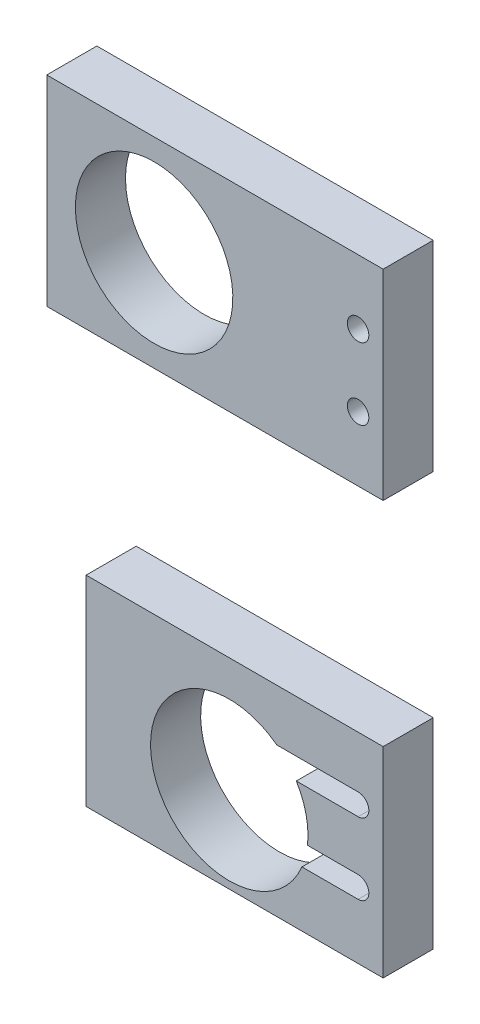
ISO-10303-21;
HEADER;
FILE_DESCRIPTION(('STEP AP214'),'2;1');
FILE_NAME('part.step','',(''),(''),'','','');
FILE_SCHEMA(('AUTOMOTIVE_DESIGN { 1 0 10303 214 1 1 1 1 }'));
ENDSEC;
DATA;
#1=APPLICATION_CONTEXT('core data for automotive mechanical design processes');
#2=APPLICATION_PROTOCOL_DEFINITION('international standard','automotive_design',2000,#1);
#3=PRODUCT_CONTEXT('',#1,'mechanical');
#4=PRODUCT('Part','Part','',(#3));
#5=PRODUCT_RELATED_PRODUCT_CATEGORY('part','',(#4));
#6=PRODUCT_DEFINITION_FORMATION('','',#4);
#7=PRODUCT_DEFINITION_CONTEXT('part definition',#1,'design');
#8=PRODUCT_DEFINITION('design','',#6,#7);
#9=PRODUCT_DEFINITION_SHAPE('','',#8);
#10=(LENGTH_UNIT() NAMED_UNIT(*) SI_UNIT(.MILLI.,.METRE.));
#11=(NAMED_UNIT(*) PLANE_ANGLE_UNIT() SI_UNIT($,.RADIAN.));
#12=(NAMED_UNIT(*) SI_UNIT($,.STERADIAN.) SOLID_ANGLE_UNIT());
#13=UNCERTAINTY_MEASURE_WITH_UNIT(LENGTH_MEASURE(1.E-05),#10,'distance_accuracy_value','');
#14=(GEOMETRIC_REPRESENTATION_CONTEXT(3) GLOBAL_UNCERTAINTY_ASSIGNED_CONTEXT((#13)) GLOBAL_UNIT_ASSIGNED_CONTEXT((#10,
#11,#12)) REPRESENTATION_CONTEXT('',''));
#15=CARTESIAN_POINT('',(0.,0.,0.));
#16=DIRECTION('',(0.,0.,1.));
#17=DIRECTION('',(1.,0.,0.));
#18=AXIS2_PLACEMENT_3D('',#15,#16,#17);
#19=CARTESIAN_POINT('',(0.,0.,-27.08));
#20=DIRECTION('',(0.,0.,-1.));
#21=DIRECTION('',(0.,1.,0.));
#22=AXIS2_PLACEMENT_3D('',#19,#20,#21);
#23=PLANE('',#22);
#24=CARTESIAN_POINT('',(0.,5.,-27.08));
#25=DIRECTION('',(0.,0.,-1.));
#26=DIRECTION('',(0.,1.,0.));
#27=AXIS2_PLACEMENT_3D('',#24,#25,#26);
#28=CIRCLE('',#27,1.5);
#29=CARTESIAN_POINT('',(0.,6.5,-27.08));
#30=VERTEX_POINT('',#29);
#31=EDGE_CURVE('E135',#30,#30,#28,.F.);
#32=ORIENTED_EDGE('',*,*,#31,.F.);
#33=EDGE_LOOP('',(#32));
#34=FACE_BOUND('',#33,.T.);
#35=DIRECTION('',(0.,-1.,0.));
#36=VECTOR('',#35,1.);
#37=CARTESIAN_POINT('',(3.5,0.,-27.08));
#38=LINE('',#37,#36);
#39=CARTESIAN_POINT('',(3.5,14.,-27.08));
#40=VERTEX_POINT('',#39);
#41=CARTESIAN_POINT('',(3.5,-14.,-27.08));
#42=VERTEX_POINT('',#41);
#43=EDGE_CURVE('E56',#40,#42,#38,.T.);
#44=ORIENTED_EDGE('',*,*,#43,.F.);
#45=DIRECTION('',(1.,0.,0.));
#46=VECTOR('',#45,1.);
#47=CARTESIAN_POINT('',(-43.5,14.,-27.08));
#48=LINE('',#47,#46);
#49=CARTESIAN_POINT('',(-43.5,14.,-27.08));
#50=VERTEX_POINT('',#49);
#51=EDGE_CURVE('E95',#50,#40,#48,.T.);
#52=ORIENTED_EDGE('',*,*,#51,.F.);
#53=DIRECTION('',(0.,1.,0.));
#54=VECTOR('',#53,1.);
#55=CARTESIAN_POINT('',(-43.5,14.,-27.08));
#56=LINE('',#55,#54);
#57=CARTESIAN_POINT('',(-43.5,-14.,-27.08));
#58=VERTEX_POINT('',#57);
#59=EDGE_CURVE('E129',#58,#50,#56,.T.);
#60=ORIENTED_EDGE('',*,*,#59,.F.);
#61=DIRECTION('',(-1.,0.,0.));
#62=VECTOR('',#61,1.);
#63=CARTESIAN_POINT('',(-3.5,-14.,-27.08));
#64=LINE('',#63,#62);
#65=EDGE_CURVE('E12',#42,#58,#64,.T.);
#66=ORIENTED_EDGE('',*,*,#65,.F.);
#67=EDGE_LOOP('',(#44,#52,#60,#66));
#68=FACE_BOUND('',#67,.T.);
#69=CARTESIAN_POINT('',(0.,-5.,-27.08));
#70=DIRECTION('',(0.,0.,-1.));
#71=DIRECTION('',(0.,1.,0.));
#72=AXIS2_PLACEMENT_3D('',#69,#70,#71);
#73=CIRCLE('',#72,1.5);
#74=CARTESIAN_POINT('',(0.,-3.5,-27.08));
#75=VERTEX_POINT('',#74);
#76=EDGE_CURVE('E106',#75,#75,#73,.F.);
#77=ORIENTED_EDGE('',*,*,#76,.F.);
#78=EDGE_LOOP('',(#77));
#79=FACE_BOUND('',#78,.T.);
#80=CARTESIAN_POINT('',(-28.5,0.,-27.08));
#81=DIRECTION('',(0.,0.,-1.));
#82=DIRECTION('',(0.,1.,0.));
#83=AXIS2_PLACEMENT_3D('',#80,#81,#82);
#84=CIRCLE('',#83,11.);
#85=CARTESIAN_POINT('',(-28.5,11.,-27.08));
#86=VERTEX_POINT('',#85);
#87=EDGE_CURVE('E119',#86,#86,#84,.T.);
#88=ORIENTED_EDGE('',*,*,#87,.T.);
#89=EDGE_LOOP('',(#88));
#90=FACE_BOUND('',#89,.T.);
#91=ADVANCED_FACE('F52',(#34,#68,#79,#90),#23,.F.);
#92=CARTESIAN_POINT('',(-43.5,0.,0.));
#93=DIRECTION('',(-1.,0.,0.));
#94=DIRECTION('',(0.,0.,1.));
#95=AXIS2_PLACEMENT_3D('',#92,#93,#94);
#96=PLANE('',#95);
#97=DIRECTION('',(0.,-1.,0.));
#98=VECTOR('',#97,1.);
#99=CARTESIAN_POINT('',(-43.5,14.,-34.08));
#100=LINE('',#99,#98);
#101=CARTESIAN_POINT('',(-43.5,14.,-34.08));
#102=VERTEX_POINT('',#101);
#103=CARTESIAN_POINT('',(-43.5,-14.,-34.08));
#104=VERTEX_POINT('',#103);
#105=EDGE_CURVE('E123',#102,#104,#100,.T.);
#106=ORIENTED_EDGE('',*,*,#105,.T.);
#107=DIRECTION('',(0.,0.,1.));
#108=VECTOR('',#107,1.);
#109=CARTESIAN_POINT('',(-43.5,-14.,-34.08));
#110=LINE('',#109,#108);
#111=EDGE_CURVE('E126',#104,#58,#110,.T.);
#112=ORIENTED_EDGE('',*,*,#111,.T.);
#113=ORIENTED_EDGE('',*,*,#59,.T.);
#114=DIRECTION('',(0.,0.,-1.));
#115=VECTOR('',#114,1.);
#116=CARTESIAN_POINT('',(-43.5,14.,-34.08));
#117=LINE('',#116,#115);
#118=EDGE_CURVE('E99',#50,#102,#117,.T.);
#119=ORIENTED_EDGE('',*,*,#118,.T.);
#120=EDGE_LOOP('',(#106,#112,#113,#119));
#121=FACE_BOUND('',#120,.T.);
#122=ADVANCED_FACE('F144',(#121),#96,.T.);
#123=CARTESIAN_POINT('',(-3.5,14.,-34.08));
#124=DIRECTION('',(0.,0.,-1.));
#125=DIRECTION('',(-1.,0.,0.));
#126=AXIS2_PLACEMENT_3D('',#123,#124,#125);
#127=PLANE('',#126);
#128=CARTESIAN_POINT('',(0.,5.,-34.08));
#129=DIRECTION('',(0.,0.,-1.));
#130=DIRECTION('',(-1.,0.,0.));
#131=AXIS2_PLACEMENT_3D('',#128,#129,#130);
#132=CIRCLE('',#131,1.5);
#133=CARTESIAN_POINT('',(-1.5,5.,-34.08));
#134=VERTEX_POINT('',#133);
#135=EDGE_CURVE('E120',#134,#134,#132,.T.);
#136=ORIENTED_EDGE('',*,*,#135,.F.);
#137=EDGE_LOOP('',(#136));
#138=FACE_BOUND('',#137,.T.);
#139=CARTESIAN_POINT('',(0.,-5.,-34.08));
#140=DIRECTION('',(0.,0.,-1.));
#141=DIRECTION('',(-1.,0.,0.));
#142=AXIS2_PLACEMENT_3D('',#139,#140,#141);
#143=CIRCLE('',#142,1.5);
#144=CARTESIAN_POINT('',(-1.5,-5.,-34.08));
#145=VERTEX_POINT('',#144);
#146=EDGE_CURVE('E133',#145,#145,#143,.T.);
#147=ORIENTED_EDGE('',*,*,#146,.F.);
#148=EDGE_LOOP('',(#147));
#149=FACE_BOUND('',#148,.T.);
#150=CARTESIAN_POINT('',(-28.5,0.,-34.08));
#151=DIRECTION('',(0.,0.,-1.));
#152=DIRECTION('',(-1.,0.,0.));
#153=AXIS2_PLACEMENT_3D('',#150,#151,#152);
#154=CIRCLE('',#153,11.);
#155=CARTESIAN_POINT('',(-39.5,0.,-34.08));
#156=VERTEX_POINT('',#155);
#157=EDGE_CURVE('E116',#156,#156,#154,.T.);
#158=ORIENTED_EDGE('',*,*,#157,.F.);
#159=EDGE_LOOP('',(#158));
#160=FACE_BOUND('',#159,.T.);
#161=DIRECTION('',(1.,0.,0.));
#162=VECTOR('',#161,1.);
#163=CARTESIAN_POINT('',(-3.5,14.,-34.08));
#164=LINE('',#163,#162);
#165=CARTESIAN_POINT('',(3.5,14.,-34.08));
#166=VERTEX_POINT('',#165);
#167=EDGE_CURVE('E61',#102,#166,#164,.T.);
#168=ORIENTED_EDGE('',*,*,#167,.T.);
#169=DIRECTION('',(0.,1.,0.));
#170=VECTOR('',#169,1.);
#171=CARTESIAN_POINT('',(3.5,14.,-34.08));
#172=LINE('',#171,#170);
#173=CARTESIAN_POINT('',(3.5,-14.,-34.08));
#174=VERTEX_POINT('',#173);
#175=EDGE_CURVE('E107',#174,#166,#172,.T.);
#176=ORIENTED_EDGE('',*,*,#175,.F.);
#177=DIRECTION('',(1.,0.,0.));
#178=VECTOR('',#177,1.);
#179=CARTESIAN_POINT('',(-3.5,-14.,-34.08));
#180=LINE('',#179,#178);
#181=EDGE_CURVE('E108',#104,#174,#180,.T.);
#182=ORIENTED_EDGE('',*,*,#181,.F.);
#183=ORIENTED_EDGE('',*,*,#105,.F.);
#184=EDGE_LOOP('',(#168,#176,#182,#183));
#185=FACE_BOUND('',#184,.T.);
#186=ADVANCED_FACE('F141',(#138,#149,#160,#185),#127,.T.);
#187=CARTESIAN_POINT('',(3.5,0.,0.));
#188=DIRECTION('',(-1.,0.,0.));
#189=DIRECTION('',(0.,0.,1.));
#190=AXIS2_PLACEMENT_3D('',#187,#188,#189);
#191=PLANE('',#190);
#192=DIRECTION('',(0.,0.,1.));
#193=VECTOR('',#192,1.);
#194=CARTESIAN_POINT('',(3.5,14.,34.08));
#195=LINE('',#194,#193);
#196=EDGE_CURVE('E97',#166,#40,#195,.T.);
#197=ORIENTED_EDGE('',*,*,#196,.T.);
#198=ORIENTED_EDGE('',*,*,#43,.T.);
#199=DIRECTION('',(0.,0.,-1.));
#200=VECTOR('',#199,1.);
#201=CARTESIAN_POINT('',(3.5,-14.,34.08));
#202=LINE('',#201,#200);
#203=EDGE_CURVE('E102',#42,#174,#202,.T.);
#204=ORIENTED_EDGE('',*,*,#203,.T.);
#205=ORIENTED_EDGE('',*,*,#175,.T.);
#206=EDGE_LOOP('',(#197,#198,#204,#205));
#207=FACE_BOUND('',#206,.T.);
#208=ADVANCED_FACE('F54',(#207),#191,.F.);
#209=CARTESIAN_POINT('',(-3.5,14.,34.08));
#210=DIRECTION('',(0.,1.,0.));
#211=DIRECTION('',(0.,0.,1.));
#212=AXIS2_PLACEMENT_3D('',#209,#210,#211);
#213=PLANE('',#212);
#214=ORIENTED_EDGE('',*,*,#51,.T.);
#215=ORIENTED_EDGE('',*,*,#196,.F.);
#216=ORIENTED_EDGE('',*,*,#167,.F.);
#217=ORIENTED_EDGE('',*,*,#118,.F.);
#218=EDGE_LOOP('',(#214,#215,#216,#217));
#219=FACE_BOUND('',#218,.T.);
#220=ADVANCED_FACE('F96',(#219),#213,.T.);
#221=CARTESIAN_POINT('',(-3.5,-14.,34.08));
#222=DIRECTION('',(0.,-1.,0.));
#223=DIRECTION('',(0.,0.,-1.));
#224=AXIS2_PLACEMENT_3D('',#221,#222,#223);
#225=PLANE('',#224);
#226=ORIENTED_EDGE('',*,*,#203,.F.);
#227=ORIENTED_EDGE('',*,*,#65,.T.);
#228=ORIENTED_EDGE('',*,*,#111,.F.);
#229=ORIENTED_EDGE('',*,*,#181,.T.);
#230=EDGE_LOOP('',(#226,#227,#228,#229));
#231=FACE_BOUND('',#230,.T.);
#232=ADVANCED_FACE('F153',(#231),#225,.T.);
#233=CARTESIAN_POINT('',(-28.5,0.,34.08));
#234=DIRECTION('',(0.,0.,-1.));
#235=DIRECTION('',(-1.,0.,0.));
#236=AXIS2_PLACEMENT_3D('',#233,#234,#235);
#237=CYLINDRICAL_SURFACE('',#236,11.);
#238=ORIENTED_EDGE('',*,*,#157,.T.);
#239=EDGE_LOOP('',(#238));
#240=FACE_BOUND('',#239,.T.);
#241=ORIENTED_EDGE('',*,*,#87,.F.);
#242=EDGE_LOOP('',(#241));
#243=FACE_BOUND('',#242,.T.);
#244=ADVANCED_FACE('F150',(#240,#243),#237,.F.);
#245=CARTESIAN_POINT('',(0.,5.,-41.58));
#246=DIRECTION('',(0.,0.,1.));
#247=DIRECTION('',(1.,0.,0.));
#248=AXIS2_PLACEMENT_3D('',#245,#246,#247);
#249=CYLINDRICAL_SURFACE('',#248,1.5);
#250=ORIENTED_EDGE('',*,*,#31,.T.);
#251=EDGE_LOOP('',(#250));
#252=FACE_BOUND('',#251,.T.);
#253=ORIENTED_EDGE('',*,*,#135,.T.);
#254=EDGE_LOOP('',(#253));
#255=FACE_BOUND('',#254,.T.);
#256=ADVANCED_FACE('F139',(#252,#255),#249,.F.);
#257=CARTESIAN_POINT('',(0.,-5.,-41.58));
#258=DIRECTION('',(0.,0.,1.));
#259=DIRECTION('',(1.,0.,0.));
#260=AXIS2_PLACEMENT_3D('',#257,#258,#259);
#261=CYLINDRICAL_SURFACE('',#260,1.5);
#262=ORIENTED_EDGE('',*,*,#76,.T.);
#263=EDGE_LOOP('',(#262));
#264=FACE_BOUND('',#263,.T.);
#265=ORIENTED_EDGE('',*,*,#146,.T.);
#266=EDGE_LOOP('',(#265));
#267=FACE_BOUND('',#266,.T.);
#268=ADVANCED_FACE('F159',(#264,#267),#261,.F.);
#269=CLOSED_SHELL('',(#91,#122,#186,#208,#220,#232,#244,#256,#268));
#270=MANIFOLD_SOLID_BREP('B2',#269);
#271=CARTESIAN_POINT('',(-18.,-59.77,34.08));
#272=DIRECTION('',(0.,0.,-1.));
#273=DIRECTION('',(-1.,0.,0.));
#274=AXIS2_PLACEMENT_3D('',#271,#272,#273);
#275=CYLINDRICAL_SURFACE('',#274,11.);
#276=CARTESIAN_POINT('',(-18.,-59.77,-34.08));
#277=DIRECTION('',(0.,0.,-1.));
#278=DIRECTION('',(-1.,0.,0.));
#279=AXIS2_PLACEMENT_3D('',#276,#277,#278);
#280=CIRCLE('',#279,11.);
#281=CARTESIAN_POINT('',(-8.63479311493867,-54.,-34.08));
#282=VERTEX_POINT('',#281);
#283=CARTESIAN_POINT('',(-7.06898449365295,-61.,-34.08));
#284=VERTEX_POINT('',#283);
#285=EDGE_CURVE('E433',#282,#284,#280,.T.);
#286=ORIENTED_EDGE('',*,*,#285,.T.);
#287=DIRECTION('',(0.,0.,-1.));
#288=VECTOR('',#287,1.);
#289=CARTESIAN_POINT('',(-7.06898449365295,-61.,34.08));
#290=LINE('',#289,#288);
#291=CARTESIAN_POINT('',(-7.06898449365295,-61.,-27.08));
#292=VERTEX_POINT('',#291);
#293=EDGE_CURVE('E485',#292,#284,#290,.T.);
#294=ORIENTED_EDGE('',*,*,#293,.F.);
#295=CARTESIAN_POINT('',(-18.,-59.77,-27.08));
#296=DIRECTION('',(0.,0.,-1.));
#297=DIRECTION('',(-1.,0.,0.));
#298=AXIS2_PLACEMENT_3D('',#295,#296,#297);
#299=CIRCLE('',#298,11.);
#300=CARTESIAN_POINT('',(-8.63479311493868,-54.,-27.08));
#301=VERTEX_POINT('',#300);
#302=EDGE_CURVE('E440',#301,#292,#299,.T.);
#303=ORIENTED_EDGE('',*,*,#302,.F.);
#304=DIRECTION('',(0.,0.,-1.));
#305=VECTOR('',#304,1.);
#306=CARTESIAN_POINT('',(-8.63479311493868,-54.,34.08));
#307=LINE('',#306,#305);
#308=EDGE_CURVE('E483',#282,#301,#307,.F.);
#309=ORIENTED_EDGE('',*,*,#308,.F.);
#310=EDGE_LOOP('',(#286,#294,#303,#309));
#311=FACE_BOUND('',#310,.T.);
#312=ADVANCED_FACE('F304',(#311),#275,.F.);
#313=CARTESIAN_POINT('',(0.,0.,-27.08));
#314=DIRECTION('',(0.,0.,-1.));
#315=DIRECTION('',(1.,0.,0.));
#316=AXIS2_PLACEMENT_3D('',#313,#314,#315);
#317=PLANE('',#316);
#318=DIRECTION('',(1.,0.,0.));
#319=VECTOR('',#318,1.);
#320=CARTESIAN_POINT('',(3.5,-71.77,-27.08));
#321=LINE('',#320,#319);
#322=CARTESIAN_POINT('',(-38.,-71.77,-27.08));
#323=VERTEX_POINT('',#322);
#324=CARTESIAN_POINT('',(3.5,-71.77,-27.08));
#325=VERTEX_POINT('',#324);
#326=EDGE_CURVE('E441',#323,#325,#321,.T.);
#327=ORIENTED_EDGE('',*,*,#326,.T.);
#328=DIRECTION('',(0.,-1.,0.));
#329=VECTOR('',#328,1.);
#330=CARTESIAN_POINT('',(3.5,0.,-27.08));
#331=LINE('',#330,#329);
#332=CARTESIAN_POINT('',(3.5,-43.77,-27.08));
#333=VERTEX_POINT('',#332);
#334=EDGE_CURVE('E50',#333,#325,#331,.T.);
#335=ORIENTED_EDGE('',*,*,#334,.F.);
#336=DIRECTION('',(-1.,0.,0.));
#337=VECTOR('',#336,1.);
#338=CARTESIAN_POINT('',(3.5,-43.77,-27.08));
#339=LINE('',#338,#337);
#340=CARTESIAN_POINT('',(-38.,-43.77,-27.08));
#341=VERTEX_POINT('',#340);
#342=EDGE_CURVE('E454',#333,#341,#339,.T.);
#343=ORIENTED_EDGE('',*,*,#342,.T.);
#344=DIRECTION('',(0.,-1.,0.));
#345=VECTOR('',#344,1.);
#346=CARTESIAN_POINT('',(-38.,-71.77,-27.08));
#347=LINE('',#346,#345);
#348=EDGE_CURVE('E456',#341,#323,#347,.T.);
#349=ORIENTED_EDGE('',*,*,#348,.T.);
#350=EDGE_LOOP('',(#327,#335,#343,#349));
#351=FACE_BOUND('',#350,.T.);
#352=ORIENTED_EDGE('',*,*,#302,.T.);
#353=DIRECTION('',(-1.,0.,0.));
#354=VECTOR('',#353,1.);
#355=CARTESIAN_POINT('',(0.,-61.,-27.08));
#356=LINE('',#355,#354);
#357=CARTESIAN_POINT('',(0.,-61.,-27.08));
#358=VERTEX_POINT('',#357);
#359=EDGE_CURVE('E424',#358,#292,#356,.T.);
#360=ORIENTED_EDGE('',*,*,#359,.F.);
#361=CARTESIAN_POINT('',(0.,-62.5,-27.08));
#362=DIRECTION('',(0.,0.,-1.));
#363=DIRECTION('',(0.,1.,0.));
#364=AXIS2_PLACEMENT_3D('',#361,#362,#363);
#365=CIRCLE('',#364,1.5);
#366=CARTESIAN_POINT('',(0.,-64.,-27.08));
#367=VERTEX_POINT('',#366);
#368=EDGE_CURVE('E308',#367,#358,#365,.F.);
#369=ORIENTED_EDGE('',*,*,#368,.F.);
#370=DIRECTION('',(1.,0.,0.));
#371=VECTOR('',#370,1.);
#372=CARTESIAN_POINT('',(0.,-64.,-27.08));
#373=LINE('',#372,#371);
#374=CARTESIAN_POINT('',(-7.8458333675284,-64.,-27.08));
#375=VERTEX_POINT('',#374);
#376=EDGE_CURVE('E405',#375,#367,#373,.T.);
#377=ORIENTED_EDGE('',*,*,#376,.F.);
#378=CARTESIAN_POINT('',(-11.3553029849798,-51.0037008048674,-27.08));
#379=VERTEX_POINT('',#378);
#380=EDGE_CURVE('E437',#375,#379,#299,.T.);
#381=ORIENTED_EDGE('',*,*,#380,.T.);
#382=CARTESIAN_POINT('',(-11.25,-52.5,-27.08));
#383=DIRECTION('',(0.,0.,-1.));
#384=DIRECTION('',(-1.,0.,0.));
#385=AXIS2_PLACEMENT_3D('',#382,#383,#384);
#386=CIRCLE('',#385,1.50000000000001);
#387=CARTESIAN_POINT('',(-11.25,-51.,-27.08));
#388=VERTEX_POINT('',#387);
#389=EDGE_CURVE('E507',#388,#379,#386,.F.);
#390=ORIENTED_EDGE('',*,*,#389,.F.);
#391=DIRECTION('',(-1.,0.,0.));
#392=VECTOR('',#391,1.);
#393=CARTESIAN_POINT('',(0.,-51.,-27.08));
#394=LINE('',#393,#392);
#395=CARTESIAN_POINT('',(0.,-51.,-27.08));
#396=VERTEX_POINT('',#395);
#397=EDGE_CURVE('E504',#396,#388,#394,.T.);
#398=ORIENTED_EDGE('',*,*,#397,.F.);
#399=CARTESIAN_POINT('',(0.,-52.5,-27.08));
#400=DIRECTION('',(0.,0.,-1.));
#401=DIRECTION('',(0.,1.,0.));
#402=AXIS2_PLACEMENT_3D('',#399,#400,#401);
#403=CIRCLE('',#402,1.5);
#404=CARTESIAN_POINT('',(0.,-54.,-27.08));
#405=VERTEX_POINT('',#404);
#406=EDGE_CURVE('E428',#405,#396,#403,.F.);
#407=ORIENTED_EDGE('',*,*,#406,.F.);
#408=DIRECTION('',(1.,0.,0.));
#409=VECTOR('',#408,1.);
#410=CARTESIAN_POINT('',(0.,-54.,-27.08));
#411=LINE('',#410,#409);
#412=EDGE_CURVE('E328',#301,#405,#411,.T.);
#413=ORIENTED_EDGE('',*,*,#412,.F.);
#414=EDGE_LOOP('',(#352,#360,#369,#377,#381,#390,#398,#407,#413));
#415=FACE_BOUND('',#414,.T.);
#416=ADVANCED_FACE('F478',(#351,#415),#317,.F.);
#417=CARTESIAN_POINT('',(3.5,-71.77,-34.08));
#418=DIRECTION('',(0.,-1.,0.));
#419=DIRECTION('',(1.,0.,0.));
#420=AXIS2_PLACEMENT_3D('',#417,#418,#419);
#421=PLANE('',#420);
#422=DIRECTION('',(0.,0.,1.));
#423=VECTOR('',#422,1.);
#424=CARTESIAN_POINT('',(3.5,-71.77,-34.08));
#425=LINE('',#424,#423);
#426=CARTESIAN_POINT('',(3.5,-71.77,-34.08));
#427=VERTEX_POINT('',#426);
#428=EDGE_CURVE('E442',#427,#325,#425,.T.);
#429=ORIENTED_EDGE('',*,*,#428,.T.);
#430=ORIENTED_EDGE('',*,*,#326,.F.);
#431=DIRECTION('',(0.,0.,1.));
#432=VECTOR('',#431,1.);
#433=CARTESIAN_POINT('',(-38.,-71.77,-34.08));
#434=LINE('',#433,#432);
#435=CARTESIAN_POINT('',(-38.,-71.77,-34.08));
#436=VERTEX_POINT('',#435);
#437=EDGE_CURVE('E445',#436,#323,#434,.T.);
#438=ORIENTED_EDGE('',*,*,#437,.F.);
#439=DIRECTION('',(1.,0.,0.));
#440=VECTOR('',#439,1.);
#441=CARTESIAN_POINT('',(3.5,-71.77,-34.08));
#442=LINE('',#441,#440);
#443=EDGE_CURVE('E466',#436,#427,#442,.T.);
#444=ORIENTED_EDGE('',*,*,#443,.T.);
#445=EDGE_LOOP('',(#429,#430,#438,#444));
#446=FACE_BOUND('',#445,.T.);
#447=ADVANCED_FACE('F538',(#446),#421,.T.);
#448=CARTESIAN_POINT('',(-38.,-71.77,-34.08));
#449=DIRECTION('',(-1.,0.,0.));
#450=DIRECTION('',(0.,0.,1.));
#451=AXIS2_PLACEMENT_3D('',#448,#449,#450);
#452=PLANE('',#451);
#453=ORIENTED_EDGE('',*,*,#348,.F.);
#454=DIRECTION('',(0.,0.,1.));
#455=VECTOR('',#454,1.);
#456=CARTESIAN_POINT('',(-38.,-43.77,-34.08));
#457=LINE('',#456,#455);
#458=CARTESIAN_POINT('',(-38.,-43.77,-34.08));
#459=VERTEX_POINT('',#458);
#460=EDGE_CURVE('E447',#459,#341,#457,.T.);
#461=ORIENTED_EDGE('',*,*,#460,.F.);
#462=DIRECTION('',(0.,-1.,0.));
#463=VECTOR('',#462,1.);
#464=CARTESIAN_POINT('',(-38.,-71.77,-34.08));
#465=LINE('',#464,#463);
#466=EDGE_CURVE('E463',#459,#436,#465,.T.);
#467=ORIENTED_EDGE('',*,*,#466,.T.);
#468=ORIENTED_EDGE('',*,*,#437,.T.);
#469=EDGE_LOOP('',(#453,#461,#467,#468));
#470=FACE_BOUND('',#469,.T.);
#471=ADVANCED_FACE('F552',(#470),#452,.T.);
#472=CARTESIAN_POINT('',(0.,0.,-34.08));
#473=DIRECTION('',(0.,0.,-1.));
#474=DIRECTION('',(1.,0.,0.));
#475=AXIS2_PLACEMENT_3D('',#472,#473,#474);
#476=PLANE('',#475);
#477=DIRECTION('',(1.,0.,0.));
#478=VECTOR('',#477,1.);
#479=CARTESIAN_POINT('',(0.,-61.,-34.08));
#480=LINE('',#479,#478);
#481=CARTESIAN_POINT('',(0.,-61.,-34.08));
#482=VERTEX_POINT('',#481);
#483=EDGE_CURVE('E423',#284,#482,#480,.T.);
#484=ORIENTED_EDGE('',*,*,#483,.F.);
#485=ORIENTED_EDGE('',*,*,#285,.F.);
#486=DIRECTION('',(-1.,0.,0.));
#487=VECTOR('',#486,1.);
#488=CARTESIAN_POINT('',(0.,-54.,-34.08));
#489=LINE('',#488,#487);
#490=CARTESIAN_POINT('',(0.,-54.,-34.08));
#491=VERTEX_POINT('',#490);
#492=EDGE_CURVE('E502',#491,#282,#489,.T.);
#493=ORIENTED_EDGE('',*,*,#492,.F.);
#494=CARTESIAN_POINT('',(0.,-52.5,-34.08));
#495=DIRECTION('',(0.,0.,-1.));
#496=DIRECTION('',(-1.,0.,0.));
#497=AXIS2_PLACEMENT_3D('',#494,#495,#496);
#498=CIRCLE('',#497,1.5);
#499=CARTESIAN_POINT('',(0.,-51.,-34.08));
#500=VERTEX_POINT('',#499);
#501=EDGE_CURVE('E429',#500,#491,#498,.T.);
#502=ORIENTED_EDGE('',*,*,#501,.F.);
#503=DIRECTION('',(1.,0.,0.));
#504=VECTOR('',#503,1.);
#505=CARTESIAN_POINT('',(0.,-51.,-34.08));
#506=LINE('',#505,#504);
#507=CARTESIAN_POINT('',(-11.25,-51.,-34.08));
#508=VERTEX_POINT('',#507);
#509=EDGE_CURVE('E320',#508,#500,#506,.T.);
#510=ORIENTED_EDGE('',*,*,#509,.F.);
#511=CARTESIAN_POINT('',(-11.25,-52.5,-34.08));
#512=DIRECTION('',(0.,0.,-1.));
#513=DIRECTION('',(-1.,0.,0.));
#514=AXIS2_PLACEMENT_3D('',#511,#512,#513);
#515=CIRCLE('',#514,1.50000000000001);
#516=CARTESIAN_POINT('',(-11.3553029849798,-51.0037008048674,-34.08));
#517=VERTEX_POINT('',#516);
#518=EDGE_CURVE('E499',#517,#508,#515,.T.);
#519=ORIENTED_EDGE('',*,*,#518,.F.);
#520=CARTESIAN_POINT('',(-7.8458333675284,-64.,-34.08));
#521=VERTEX_POINT('',#520);
#522=EDGE_CURVE('E422',#521,#517,#280,.T.);
#523=ORIENTED_EDGE('',*,*,#522,.F.);
#524=DIRECTION('',(-1.,0.,0.));
#525=VECTOR('',#524,1.);
#526=CARTESIAN_POINT('',(0.,-64.,-34.08));
#527=LINE('',#526,#525);
#528=CARTESIAN_POINT('',(0.,-64.,-34.08));
#529=VERTEX_POINT('',#528);
#530=EDGE_CURVE('E402',#529,#521,#527,.T.);
#531=ORIENTED_EDGE('',*,*,#530,.F.);
#532=CARTESIAN_POINT('',(0.,-62.5,-34.08));
#533=DIRECTION('',(0.,0.,-1.));
#534=DIRECTION('',(-1.,0.,0.));
#535=AXIS2_PLACEMENT_3D('',#532,#533,#534);
#536=CIRCLE('',#535,1.5);
#537=EDGE_CURVE('E419',#482,#529,#536,.T.);
#538=ORIENTED_EDGE('',*,*,#537,.F.);
#539=EDGE_LOOP('',(#484,#485,#493,#502,#510,#519,#523,#531,#538));
#540=FACE_BOUND('',#539,.T.);
#541=DIRECTION('',(0.,1.,0.));
#542=VECTOR('',#541,1.);
#543=CARTESIAN_POINT('',(3.5,-71.77,-34.08));
#544=LINE('',#543,#542);
#545=CARTESIAN_POINT('',(3.5,-43.77,-34.08));
#546=VERTEX_POINT('',#545);
#547=EDGE_CURVE('E457',#427,#546,#544,.T.);
#548=ORIENTED_EDGE('',*,*,#547,.F.);
#549=ORIENTED_EDGE('',*,*,#443,.F.);
#550=ORIENTED_EDGE('',*,*,#466,.F.);
#551=DIRECTION('',(-1.,0.,0.));
#552=VECTOR('',#551,1.);
#553=CARTESIAN_POINT('',(3.5,-43.77,-34.08));
#554=LINE('',#553,#552);
#555=EDGE_CURVE('E453',#546,#459,#554,.T.);
#556=ORIENTED_EDGE('',*,*,#555,.F.);
#557=EDGE_LOOP('',(#548,#549,#550,#556));
#558=FACE_BOUND('',#557,.T.);
#559=ADVANCED_FACE('F417',(#540,#558),#476,.T.);
#560=CARTESIAN_POINT('',(3.5,0.,0.));
#561=DIRECTION('',(-1.,0.,0.));
#562=DIRECTION('',(0.,0.,1.));
#563=AXIS2_PLACEMENT_3D('',#560,#561,#562);
#564=PLANE('',#563);
#565=DIRECTION('',(0.,0.,1.));
#566=VECTOR('',#565,1.);
#567=CARTESIAN_POINT('',(3.5,-43.77,-34.08));
#568=LINE('',#567,#566);
#569=EDGE_CURVE('E450',#546,#333,#568,.T.);
#570=ORIENTED_EDGE('',*,*,#569,.T.);
#571=ORIENTED_EDGE('',*,*,#334,.T.);
#572=ORIENTED_EDGE('',*,*,#428,.F.);
#573=ORIENTED_EDGE('',*,*,#547,.T.);
#574=EDGE_LOOP('',(#570,#571,#572,#573));
#575=FACE_BOUND('',#574,.T.);
#576=ADVANCED_FACE('F306',(#575),#564,.F.);
#577=CARTESIAN_POINT('',(3.5,-43.77,-34.08));
#578=DIRECTION('',(0.,1.,0.));
#579=DIRECTION('',(-1.,0.,0.));
#580=AXIS2_PLACEMENT_3D('',#577,#578,#579);
#581=PLANE('',#580);
#582=ORIENTED_EDGE('',*,*,#342,.F.);
#583=ORIENTED_EDGE('',*,*,#569,.F.);
#584=ORIENTED_EDGE('',*,*,#555,.T.);
#585=ORIENTED_EDGE('',*,*,#460,.T.);
#586=EDGE_LOOP('',(#582,#583,#584,#585));
#587=FACE_BOUND('',#586,.T.);
#588=ADVANCED_FACE('F543',(#587),#581,.T.);
#589=ORIENTED_EDGE('',*,*,#380,.F.);
#590=DIRECTION('',(0.,0.,-1.));
#591=VECTOR('',#590,1.);
#592=CARTESIAN_POINT('',(-7.8458333675284,-64.,34.08));
#593=LINE('',#592,#591);
#594=EDGE_CURVE('E487',#521,#375,#593,.F.);
#595=ORIENTED_EDGE('',*,*,#594,.F.);
#596=ORIENTED_EDGE('',*,*,#522,.T.);
#597=DIRECTION('',(0.,0.,-1.));
#598=VECTOR('',#597,1.);
#599=CARTESIAN_POINT('',(-11.3553029849798,-51.0037008048674,-30.58));
#600=LINE('',#599,#598);
#601=EDGE_CURVE('E509',#379,#517,#600,.T.);
#602=ORIENTED_EDGE('',*,*,#601,.F.);
#603=EDGE_LOOP('',(#589,#595,#596,#602));
#604=FACE_BOUND('',#603,.T.);
#605=ADVANCED_FACE('F534',(#604),#275,.F.);
#606=CARTESIAN_POINT('',(0.,-52.5,-41.58));
#607=DIRECTION('',(0.,0.,1.));
#608=DIRECTION('',(1.,0.,0.));
#609=AXIS2_PLACEMENT_3D('',#606,#607,#608);
#610=CYLINDRICAL_SURFACE('',#609,1.5);
#611=ORIENTED_EDGE('',*,*,#406,.T.);
#612=DIRECTION('',(0.,0.,1.));
#613=VECTOR('',#612,1.);
#614=CARTESIAN_POINT('',(0.,-51.,-41.58));
#615=LINE('',#614,#613);
#616=EDGE_CURVE('E512',#500,#396,#615,.T.);
#617=ORIENTED_EDGE('',*,*,#616,.F.);
#618=ORIENTED_EDGE('',*,*,#501,.T.);
#619=DIRECTION('',(0.,0.,1.));
#620=VECTOR('',#619,1.);
#621=CARTESIAN_POINT('',(0.,-54.,-41.58));
#622=LINE('',#621,#620);
#623=EDGE_CURVE('E411',#491,#405,#622,.T.);
#624=ORIENTED_EDGE('',*,*,#623,.T.);
#625=EDGE_LOOP('',(#611,#617,#618,#624));
#626=FACE_BOUND('',#625,.T.);
#627=ADVANCED_FACE('F514',(#626),#610,.F.);
#628=CARTESIAN_POINT('',(0.,-62.5,-41.58));
#629=DIRECTION('',(0.,0.,1.));
#630=DIRECTION('',(1.,0.,0.));
#631=AXIS2_PLACEMENT_3D('',#628,#629,#630);
#632=CYLINDRICAL_SURFACE('',#631,1.5);
#633=ORIENTED_EDGE('',*,*,#368,.T.);
#634=DIRECTION('',(0.,0.,1.));
#635=VECTOR('',#634,1.);
#636=CARTESIAN_POINT('',(0.,-61.,-41.58));
#637=LINE('',#636,#635);
#638=EDGE_CURVE('E410',#482,#358,#637,.T.);
#639=ORIENTED_EDGE('',*,*,#638,.F.);
#640=ORIENTED_EDGE('',*,*,#537,.T.);
#641=DIRECTION('',(0.,0.,1.));
#642=VECTOR('',#641,1.);
#643=CARTESIAN_POINT('',(0.,-64.,-41.58));
#644=LINE('',#643,#642);
#645=EDGE_CURVE('E399',#529,#367,#644,.T.);
#646=ORIENTED_EDGE('',*,*,#645,.T.);
#647=EDGE_LOOP('',(#633,#639,#640,#646));
#648=FACE_BOUND('',#647,.T.);
#649=ADVANCED_FACE('F427',(#648),#632,.F.);
#650=CARTESIAN_POINT('',(0.,-64.,-27.079));
#651=DIRECTION('',(0.,-1.,0.));
#652=DIRECTION('',(0.,0.,-1.));
#653=AXIS2_PLACEMENT_3D('',#650,#651,#652);
#654=PLANE('',#653);
#655=ORIENTED_EDGE('',*,*,#376,.T.);
#656=ORIENTED_EDGE('',*,*,#645,.F.);
#657=ORIENTED_EDGE('',*,*,#530,.T.);
#658=ORIENTED_EDGE('',*,*,#594,.T.);
#659=EDGE_LOOP('',(#655,#656,#657,#658));
#660=FACE_BOUND('',#659,.T.);
#661=ADVANCED_FACE('F401',(#660),#654,.F.);
#662=CARTESIAN_POINT('',(0.,-61.,-27.079));
#663=DIRECTION('',(0.,1.,0.));
#664=DIRECTION('',(0.,0.,1.));
#665=AXIS2_PLACEMENT_3D('',#662,#663,#664);
#666=PLANE('',#665);
#667=ORIENTED_EDGE('',*,*,#359,.T.);
#668=ORIENTED_EDGE('',*,*,#293,.T.);
#669=ORIENTED_EDGE('',*,*,#483,.T.);
#670=ORIENTED_EDGE('',*,*,#638,.T.);
#671=EDGE_LOOP('',(#667,#668,#669,#670));
#672=FACE_BOUND('',#671,.T.);
#673=ADVANCED_FACE('F522',(#672),#666,.F.);
#674=CARTESIAN_POINT('',(0.,-54.,-27.079));
#675=DIRECTION('',(0.,-1.,0.));
#676=DIRECTION('',(0.,0.,-1.));
#677=AXIS2_PLACEMENT_3D('',#674,#675,#676);
#678=PLANE('',#677);
#679=ORIENTED_EDGE('',*,*,#412,.T.);
#680=ORIENTED_EDGE('',*,*,#623,.F.);
#681=ORIENTED_EDGE('',*,*,#492,.T.);
#682=ORIENTED_EDGE('',*,*,#308,.T.);
#683=EDGE_LOOP('',(#679,#680,#681,#682));
#684=FACE_BOUND('',#683,.T.);
#685=ADVANCED_FACE('F520',(#684),#678,.F.);
#686=CARTESIAN_POINT('',(0.,-51.,-27.079));
#687=DIRECTION('',(0.,1.,0.));
#688=DIRECTION('',(0.,0.,1.));
#689=AXIS2_PLACEMENT_3D('',#686,#687,#688);
#690=PLANE('',#689);
#691=ORIENTED_EDGE('',*,*,#397,.T.);
#692=DIRECTION('',(0.,0.,-1.));
#693=VECTOR('',#692,1.);
#694=CARTESIAN_POINT('',(-11.25,-51.,-27.079));
#695=LINE('',#694,#693);
#696=EDGE_CURVE('E496',#388,#508,#695,.T.);
#697=ORIENTED_EDGE('',*,*,#696,.T.);
#698=ORIENTED_EDGE('',*,*,#509,.T.);
#699=ORIENTED_EDGE('',*,*,#616,.T.);
#700=EDGE_LOOP('',(#691,#697,#698,#699));
#701=FACE_BOUND('',#700,.T.);
#702=ADVANCED_FACE('F519',(#701),#690,.F.);
#703=CARTESIAN_POINT('',(-11.25,-52.5,-27.079));
#704=DIRECTION('',(0.,0.,-1.));
#705=DIRECTION('',(-1.,0.,0.));
#706=AXIS2_PLACEMENT_3D('',#703,#704,#705);
#707=CYLINDRICAL_SURFACE('',#706,1.50000000000001);
#708=ORIENTED_EDGE('',*,*,#389,.T.);
#709=ORIENTED_EDGE('',*,*,#601,.T.);
#710=ORIENTED_EDGE('',*,*,#518,.T.);
#711=ORIENTED_EDGE('',*,*,#696,.F.);
#712=EDGE_LOOP('',(#708,#709,#710,#711));
#713=FACE_BOUND('',#712,.T.);
#714=ADVANCED_FACE('F528',(#713),#707,.F.);
#715=CLOSED_SHELL('',(#312,#416,#447,#471,#559,#576,#588,#605,#627,#649,#661,#673,#685,#702,#714));
#716=MANIFOLD_SOLID_BREP('B6',#715);
#717=ADVANCED_BREP_SHAPE_REPRESENTATION('',(#18,#270,#716),#14);
#718=SHAPE_DEFINITION_REPRESENTATION(#9,#717);
ENDSEC;
END-ISO-10303-21;
